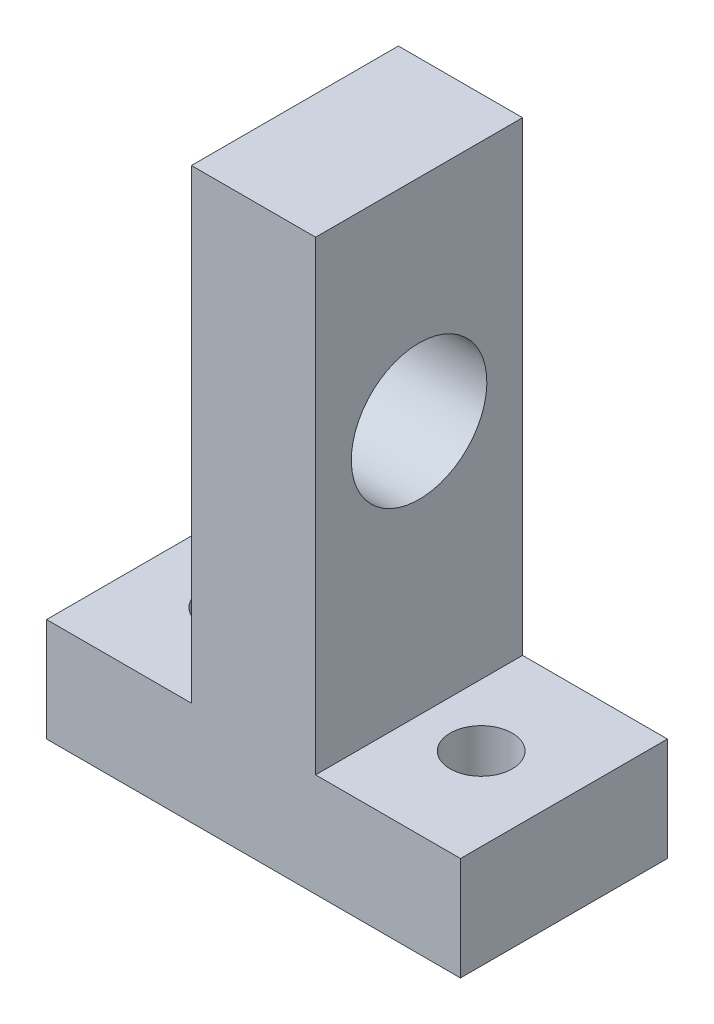
ISO-10303-21;
HEADER;
FILE_DESCRIPTION(('STEP AP214'),'2;1');
FILE_NAME('part.step','',(''),(''),'','','');
FILE_SCHEMA(('AUTOMOTIVE_DESIGN { 1 0 10303 214 1 1 1 1 }'));
ENDSEC;
DATA;
#1=APPLICATION_CONTEXT('core data for automotive mechanical design processes');
#2=APPLICATION_PROTOCOL_DEFINITION('international standard','automotive_design',2000,#1);
#3=PRODUCT_CONTEXT('',#1,'mechanical');
#4=PRODUCT('Part','Part','',(#3));
#5=PRODUCT_RELATED_PRODUCT_CATEGORY('part','',(#4));
#6=PRODUCT_DEFINITION_FORMATION('','',#4);
#7=PRODUCT_DEFINITION_CONTEXT('part definition',#1,'design');
#8=PRODUCT_DEFINITION('design','',#6,#7);
#9=PRODUCT_DEFINITION_SHAPE('','',#8);
#10=(LENGTH_UNIT() NAMED_UNIT(*) SI_UNIT(.MILLI.,.METRE.));
#11=(NAMED_UNIT(*) PLANE_ANGLE_UNIT() SI_UNIT($,.RADIAN.));
#12=(NAMED_UNIT(*) SI_UNIT($,.STERADIAN.) SOLID_ANGLE_UNIT());
#13=UNCERTAINTY_MEASURE_WITH_UNIT(LENGTH_MEASURE(1.E-05),#10,'distance_accuracy_value','');
#14=(GEOMETRIC_REPRESENTATION_CONTEXT(3) GLOBAL_UNCERTAINTY_ASSIGNED_CONTEXT((#13)) GLOBAL_UNIT_ASSIGNED_CONTEXT((#10,
#11,#12)) REPRESENTATION_CONTEXT('',''));
#15=CARTESIAN_POINT('',(0.,0.,0.));
#16=DIRECTION('',(0.,0.,1.));
#17=DIRECTION('',(1.,0.,0.));
#18=AXIS2_PLACEMENT_3D('',#15,#16,#17);
#19=CARTESIAN_POINT('',(3.,0.,5.));
#20=DIRECTION('',(1.,0.,0.));
#21=DIRECTION('',(0.,1.,0.));
#22=AXIS2_PLACEMENT_3D('',#19,#20,#21);
#23=PLANE('',#22);
#24=CARTESIAN_POINT('',(3.,3.55,0.));
#25=DIRECTION('',(1.,0.,0.));
#26=DIRECTION('',(0.,1.,0.));
#27=AXIS2_PLACEMENT_3D('',#24,#25,#26);
#28=CIRCLE('',#27,3.275);
#29=CARTESIAN_POINT('',(3.,6.825,0.));
#30=VERTEX_POINT('',#29);
#31=EDGE_CURVE('E185',#30,#30,#28,.T.);
#32=ORIENTED_EDGE('',*,*,#31,.F.);
#33=EDGE_LOOP('',(#32));
#34=FACE_BOUND('',#33,.T.);
#35=DIRECTION('',(0.,-1.,0.));
#36=VECTOR('',#35,1.);
#37=CARTESIAN_POINT('',(3.,0.,-5.));
#38=LINE('',#37,#36);
#39=CARTESIAN_POINT('',(3.,13.75,-5.));
#40=VERTEX_POINT('',#39);
#41=CARTESIAN_POINT('',(3.00000000000001,-8.75,-5.));
#42=VERTEX_POINT('',#41);
#43=EDGE_CURVE('E141',#40,#42,#38,.T.);
#44=ORIENTED_EDGE('',*,*,#43,.F.);
#45=DIRECTION('',(0.,0.,-1.));
#46=VECTOR('',#45,1.);
#47=CARTESIAN_POINT('',(3.,13.75,5.));
#48=LINE('',#47,#46);
#49=CARTESIAN_POINT('',(3.,13.75,5.));
#50=VERTEX_POINT('',#49);
#51=EDGE_CURVE('E11',#50,#40,#48,.T.);
#52=ORIENTED_EDGE('',*,*,#51,.F.);
#53=DIRECTION('',(0.,-1.,0.));
#54=VECTOR('',#53,1.);
#55=CARTESIAN_POINT('',(3.,0.,5.));
#56=LINE('',#55,#54);
#57=CARTESIAN_POINT('',(3.00000000000001,-8.75,5.));
#58=VERTEX_POINT('',#57);
#59=EDGE_CURVE('E166',#50,#58,#56,.T.);
#60=ORIENTED_EDGE('',*,*,#59,.T.);
#61=DIRECTION('',(0.,0.,-1.));
#62=VECTOR('',#61,1.);
#63=CARTESIAN_POINT('',(3.00000000000001,-8.75,5.));
#64=LINE('',#63,#62);
#65=EDGE_CURVE('E59',#58,#42,#64,.T.);
#66=ORIENTED_EDGE('',*,*,#65,.T.);
#67=EDGE_LOOP('',(#44,#52,#60,#66));
#68=FACE_BOUND('',#67,.T.);
#69=ADVANCED_FACE('F40',(#34,#68),#23,.T.);
#70=CARTESIAN_POINT('',(0.,13.75,5.));
#71=DIRECTION('',(0.,-1.,0.));
#72=DIRECTION('',(0.,0.,-1.));
#73=AXIS2_PLACEMENT_3D('',#70,#71,#72);
#74=PLANE('',#73);
#75=DIRECTION('',(-1.,0.,0.));
#76=VECTOR('',#75,1.);
#77=CARTESIAN_POINT('',(0.,13.75,-5.));
#78=LINE('',#77,#76);
#79=CARTESIAN_POINT('',(-3.,13.75,-5.));
#80=VERTEX_POINT('',#79);
#81=EDGE_CURVE('E144',#40,#80,#78,.T.);
#82=ORIENTED_EDGE('',*,*,#81,.T.);
#83=DIRECTION('',(0.,0.,-1.));
#84=VECTOR('',#83,1.);
#85=CARTESIAN_POINT('',(-3.,13.75,5.));
#86=LINE('',#85,#84);
#87=CARTESIAN_POINT('',(-3.,13.75,5.));
#88=VERTEX_POINT('',#87);
#89=EDGE_CURVE('E50',#88,#80,#86,.T.);
#90=ORIENTED_EDGE('',*,*,#89,.F.);
#91=DIRECTION('',(-1.,0.,0.));
#92=VECTOR('',#91,1.);
#93=CARTESIAN_POINT('',(0.,13.75,5.));
#94=LINE('',#93,#92);
#95=EDGE_CURVE('E201',#50,#88,#94,.T.);
#96=ORIENTED_EDGE('',*,*,#95,.F.);
#97=ORIENTED_EDGE('',*,*,#51,.T.);
#98=EDGE_LOOP('',(#82,#90,#96,#97));
#99=FACE_BOUND('',#98,.T.);
#100=ADVANCED_FACE('F238',(#99),#74,.F.);
#101=CARTESIAN_POINT('',(-3.,0.,5.));
#102=DIRECTION('',(1.,0.,0.));
#103=DIRECTION('',(0.,1.,0.));
#104=AXIS2_PLACEMENT_3D('',#101,#102,#103);
#105=PLANE('',#104);
#106=CARTESIAN_POINT('',(-3.,3.55,0.));
#107=DIRECTION('',(1.,0.,0.));
#108=DIRECTION('',(0.,1.,0.));
#109=AXIS2_PLACEMENT_3D('',#106,#107,#108);
#110=CIRCLE('',#109,3.275);
#111=CARTESIAN_POINT('',(-3.,6.825,0.));
#112=VERTEX_POINT('',#111);
#113=EDGE_CURVE('E145',#112,#112,#110,.T.);
#114=ORIENTED_EDGE('',*,*,#113,.T.);
#115=EDGE_LOOP('',(#114));
#116=FACE_BOUND('',#115,.T.);
#117=DIRECTION('',(0.,-1.,0.));
#118=VECTOR('',#117,1.);
#119=CARTESIAN_POINT('',(-3.,0.,-5.));
#120=LINE('',#119,#118);
#121=CARTESIAN_POINT('',(-3.,-8.75,-5.));
#122=VERTEX_POINT('',#121);
#123=EDGE_CURVE('E148',#80,#122,#120,.T.);
#124=ORIENTED_EDGE('',*,*,#123,.T.);
#125=DIRECTION('',(0.,0.,-1.));
#126=VECTOR('',#125,1.);
#127=CARTESIAN_POINT('',(-3.,-8.75,5.));
#128=LINE('',#127,#126);
#129=CARTESIAN_POINT('',(-3.,-8.75,5.));
#130=VERTEX_POINT('',#129);
#131=EDGE_CURVE('E177',#130,#122,#128,.T.);
#132=ORIENTED_EDGE('',*,*,#131,.F.);
#133=DIRECTION('',(0.,-1.,0.));
#134=VECTOR('',#133,1.);
#135=CARTESIAN_POINT('',(-3.,0.,5.));
#136=LINE('',#135,#134);
#137=EDGE_CURVE('E204',#88,#130,#136,.T.);
#138=ORIENTED_EDGE('',*,*,#137,.F.);
#139=ORIENTED_EDGE('',*,*,#89,.T.);
#140=EDGE_LOOP('',(#124,#132,#138,#139));
#141=FACE_BOUND('',#140,.T.);
#142=ADVANCED_FACE('F243',(#116,#141),#105,.F.);
#143=CARTESIAN_POINT('',(0.,-8.75,5.));
#144=DIRECTION('',(0.,-1.,0.));
#145=DIRECTION('',(0.,0.,-1.));
#146=AXIS2_PLACEMENT_3D('',#143,#144,#145);
#147=PLANE('',#146);
#148=CARTESIAN_POINT('',(-6.,-8.75,0.));
#149=DIRECTION('',(0.,-1.,0.));
#150=DIRECTION('',(0.,0.,-1.));
#151=AXIS2_PLACEMENT_3D('',#148,#149,#150);
#152=CIRCLE('',#151,1.5);
#153=CARTESIAN_POINT('',(-6.,-8.75,-1.5));
#154=VERTEX_POINT('',#153);
#155=EDGE_CURVE('E190',#154,#154,#152,.T.);
#156=ORIENTED_EDGE('',*,*,#155,.T.);
#157=EDGE_LOOP('',(#156));
#158=FACE_BOUND('',#157,.T.);
#159=DIRECTION('',(-1.,0.,0.));
#160=VECTOR('',#159,1.);
#161=CARTESIAN_POINT('',(0.,-8.75,-5.));
#162=LINE('',#161,#160);
#163=CARTESIAN_POINT('',(-9.99999999999999,-8.75,-5.));
#164=VERTEX_POINT('',#163);
#165=EDGE_CURVE('E151',#122,#164,#162,.T.);
#166=ORIENTED_EDGE('',*,*,#165,.T.);
#167=DIRECTION('',(0.,0.,-1.));
#168=VECTOR('',#167,1.);
#169=CARTESIAN_POINT('',(-9.99999999999999,-8.75,5.));
#170=LINE('',#169,#168);
#171=CARTESIAN_POINT('',(-9.99999999999999,-8.75,5.));
#172=VERTEX_POINT('',#171);
#173=EDGE_CURVE('E173',#172,#164,#170,.T.);
#174=ORIENTED_EDGE('',*,*,#173,.F.);
#175=DIRECTION('',(-1.,0.,0.));
#176=VECTOR('',#175,1.);
#177=CARTESIAN_POINT('',(0.,-8.75,5.));
#178=LINE('',#177,#176);
#179=EDGE_CURVE('E207',#130,#172,#178,.T.);
#180=ORIENTED_EDGE('',*,*,#179,.F.);
#181=ORIENTED_EDGE('',*,*,#131,.T.);
#182=EDGE_LOOP('',(#166,#174,#180,#181));
#183=FACE_BOUND('',#182,.T.);
#184=ADVANCED_FACE('F215',(#158,#183),#147,.F.);
#185=CARTESIAN_POINT('',(-9.99999999999999,0.,5.));
#186=DIRECTION('',(1.,0.,0.));
#187=DIRECTION('',(0.,0.,-1.));
#188=AXIS2_PLACEMENT_3D('',#185,#186,#187);
#189=PLANE('',#188);
#190=DIRECTION('',(0.,-1.,0.));
#191=VECTOR('',#190,1.);
#192=CARTESIAN_POINT('',(-9.99999999999999,0.,-5.));
#193=LINE('',#192,#191);
#194=CARTESIAN_POINT('',(-9.99999999999999,-13.75,-5.));
#195=VERTEX_POINT('',#194);
#196=EDGE_CURVE('E154',#164,#195,#193,.T.);
#197=ORIENTED_EDGE('',*,*,#196,.T.);
#198=DIRECTION('',(0.,0.,-1.));
#199=VECTOR('',#198,1.);
#200=CARTESIAN_POINT('',(-9.99999999999999,-13.75,5.));
#201=LINE('',#200,#199);
#202=CARTESIAN_POINT('',(-9.99999999999999,-13.75,5.));
#203=VERTEX_POINT('',#202);
#204=EDGE_CURVE('E131',#203,#195,#201,.T.);
#205=ORIENTED_EDGE('',*,*,#204,.F.);
#206=DIRECTION('',(0.,-1.,0.));
#207=VECTOR('',#206,1.);
#208=CARTESIAN_POINT('',(-9.99999999999999,0.,5.));
#209=LINE('',#208,#207);
#210=EDGE_CURVE('E117',#172,#203,#209,.T.);
#211=ORIENTED_EDGE('',*,*,#210,.F.);
#212=ORIENTED_EDGE('',*,*,#173,.T.);
#213=EDGE_LOOP('',(#197,#205,#211,#212));
#214=FACE_BOUND('',#213,.T.);
#215=ADVANCED_FACE('F219',(#214),#189,.F.);
#216=CARTESIAN_POINT('',(0.,-13.75,5.));
#217=DIRECTION('',(0.,1.,0.));
#218=DIRECTION('',(-1.,0.,0.));
#219=AXIS2_PLACEMENT_3D('',#216,#217,#218);
#220=PLANE('',#219);
#221=CARTESIAN_POINT('',(-6.,-13.75,0.));
#222=DIRECTION('',(0.,-1.,0.));
#223=DIRECTION('',(1.,0.,0.));
#224=AXIS2_PLACEMENT_3D('',#221,#222,#223);
#225=CIRCLE('',#224,1.5);
#226=CARTESIAN_POINT('',(-4.5,-13.75,0.));
#227=VERTEX_POINT('',#226);
#228=EDGE_CURVE('E261',#227,#227,#225,.T.);
#229=ORIENTED_EDGE('',*,*,#228,.F.);
#230=EDGE_LOOP('',(#229));
#231=FACE_BOUND('',#230,.T.);
#232=CARTESIAN_POINT('',(6.,-13.75,0.));
#233=DIRECTION('',(0.,-1.,0.));
#234=DIRECTION('',(-1.,0.,0.));
#235=AXIS2_PLACEMENT_3D('',#232,#233,#234);
#236=CIRCLE('',#235,1.5);
#237=CARTESIAN_POINT('',(4.5,-13.75,0.));
#238=VERTEX_POINT('',#237);
#239=EDGE_CURVE('E264',#238,#238,#236,.T.);
#240=ORIENTED_EDGE('',*,*,#239,.F.);
#241=EDGE_LOOP('',(#240));
#242=FACE_BOUND('',#241,.T.);
#243=DIRECTION('',(1.,0.,0.));
#244=VECTOR('',#243,1.);
#245=CARTESIAN_POINT('',(0.,-13.75,-5.));
#246=LINE('',#245,#244);
#247=CARTESIAN_POINT('',(10.,-13.75,-5.));
#248=VERTEX_POINT('',#247);
#249=EDGE_CURVE('E127',#195,#248,#246,.T.);
#250=ORIENTED_EDGE('',*,*,#249,.T.);
#251=DIRECTION('',(0.,0.,-1.));
#252=VECTOR('',#251,1.);
#253=CARTESIAN_POINT('',(10.,-13.75,5.));
#254=LINE('',#253,#252);
#255=CARTESIAN_POINT('',(10.,-13.75,5.));
#256=VERTEX_POINT('',#255);
#257=EDGE_CURVE('E124',#256,#248,#254,.T.);
#258=ORIENTED_EDGE('',*,*,#257,.F.);
#259=DIRECTION('',(1.,0.,0.));
#260=VECTOR('',#259,1.);
#261=CARTESIAN_POINT('',(0.,-13.75,5.));
#262=LINE('',#261,#260);
#263=EDGE_CURVE('E109',#203,#256,#262,.T.);
#264=ORIENTED_EDGE('',*,*,#263,.F.);
#265=ORIENTED_EDGE('',*,*,#204,.T.);
#266=EDGE_LOOP('',(#250,#258,#264,#265));
#267=FACE_BOUND('',#266,.T.);
#268=ADVANCED_FACE('F125',(#231,#242,#267),#220,.F.);
#269=CARTESIAN_POINT('',(10.,0.,5.));
#270=DIRECTION('',(1.,0.,0.));
#271=DIRECTION('',(0.,0.,-1.));
#272=AXIS2_PLACEMENT_3D('',#269,#270,#271);
#273=PLANE('',#272);
#274=DIRECTION('',(0.,-1.,0.));
#275=VECTOR('',#274,1.);
#276=CARTESIAN_POINT('',(10.,0.,-5.));
#277=LINE('',#276,#275);
#278=CARTESIAN_POINT('',(10.,-8.75,-5.));
#279=VERTEX_POINT('',#278);
#280=EDGE_CURVE('E159',#279,#248,#277,.T.);
#281=ORIENTED_EDGE('',*,*,#280,.F.);
#282=DIRECTION('',(0.,0.,-1.));
#283=VECTOR('',#282,1.);
#284=CARTESIAN_POINT('',(10.,-8.75,5.));
#285=LINE('',#284,#283);
#286=CARTESIAN_POINT('',(10.,-8.75,5.));
#287=VERTEX_POINT('',#286);
#288=EDGE_CURVE('E84',#287,#279,#285,.T.);
#289=ORIENTED_EDGE('',*,*,#288,.F.);
#290=DIRECTION('',(0.,-1.,0.));
#291=VECTOR('',#290,1.);
#292=CARTESIAN_POINT('',(10.,0.,5.));
#293=LINE('',#292,#291);
#294=EDGE_CURVE('E115',#287,#256,#293,.T.);
#295=ORIENTED_EDGE('',*,*,#294,.T.);
#296=ORIENTED_EDGE('',*,*,#257,.T.);
#297=EDGE_LOOP('',(#281,#289,#295,#296));
#298=FACE_BOUND('',#297,.T.);
#299=ADVANCED_FACE('F133',(#298),#273,.T.);
#300=CARTESIAN_POINT('',(0.,-8.75,5.));
#301=DIRECTION('',(0.,1.,0.));
#302=DIRECTION('',(-1.,0.,0.));
#303=AXIS2_PLACEMENT_3D('',#300,#301,#302);
#304=PLANE('',#303);
#305=CARTESIAN_POINT('',(6.,-8.75,0.));
#306=DIRECTION('',(0.,1.,0.));
#307=DIRECTION('',(-1.,0.,0.));
#308=AXIS2_PLACEMENT_3D('',#305,#306,#307);
#309=CIRCLE('',#308,1.5);
#310=CARTESIAN_POINT('',(4.5,-8.75,0.));
#311=VERTEX_POINT('',#310);
#312=EDGE_CURVE('E43',#311,#311,#309,.T.);
#313=ORIENTED_EDGE('',*,*,#312,.F.);
#314=EDGE_LOOP('',(#313));
#315=FACE_BOUND('',#314,.T.);
#316=DIRECTION('',(1.,0.,0.));
#317=VECTOR('',#316,1.);
#318=CARTESIAN_POINT('',(0.,-8.75,-5.));
#319=LINE('',#318,#317);
#320=EDGE_CURVE('E162',#42,#279,#319,.T.);
#321=ORIENTED_EDGE('',*,*,#320,.F.);
#322=ORIENTED_EDGE('',*,*,#65,.F.);
#323=DIRECTION('',(1.,0.,0.));
#324=VECTOR('',#323,1.);
#325=CARTESIAN_POINT('',(0.,-8.75,5.));
#326=LINE('',#325,#324);
#327=EDGE_CURVE('E135',#58,#287,#326,.T.);
#328=ORIENTED_EDGE('',*,*,#327,.T.);
#329=ORIENTED_EDGE('',*,*,#288,.T.);
#330=EDGE_LOOP('',(#321,#322,#328,#329));
#331=FACE_BOUND('',#330,.T.);
#332=ADVANCED_FACE('F223',(#315,#331),#304,.T.);
#333=CARTESIAN_POINT('',(0.,0.,5.));
#334=DIRECTION('',(0.,0.,1.));
#335=DIRECTION('',(1.,0.,0.));
#336=AXIS2_PLACEMENT_3D('',#333,#334,#335);
#337=PLANE('',#336);
#338=ORIENTED_EDGE('',*,*,#59,.F.);
#339=ORIENTED_EDGE('',*,*,#95,.T.);
#340=ORIENTED_EDGE('',*,*,#137,.T.);
#341=ORIENTED_EDGE('',*,*,#179,.T.);
#342=ORIENTED_EDGE('',*,*,#210,.T.);
#343=ORIENTED_EDGE('',*,*,#263,.T.);
#344=ORIENTED_EDGE('',*,*,#294,.F.);
#345=ORIENTED_EDGE('',*,*,#327,.F.);
#346=EDGE_LOOP('',(#338,#339,#340,#341,#342,#343,#344,#345));
#347=FACE_BOUND('',#346,.T.);
#348=ADVANCED_FACE('F112',(#347),#337,.T.);
#349=CARTESIAN_POINT('',(0.,0.,-5.));
#350=DIRECTION('',(0.,0.,1.));
#351=DIRECTION('',(1.,0.,0.));
#352=AXIS2_PLACEMENT_3D('',#349,#350,#351);
#353=PLANE('',#352);
#354=ORIENTED_EDGE('',*,*,#43,.T.);
#355=ORIENTED_EDGE('',*,*,#320,.T.);
#356=ORIENTED_EDGE('',*,*,#280,.T.);
#357=ORIENTED_EDGE('',*,*,#249,.F.);
#358=ORIENTED_EDGE('',*,*,#196,.F.);
#359=ORIENTED_EDGE('',*,*,#165,.F.);
#360=ORIENTED_EDGE('',*,*,#123,.F.);
#361=ORIENTED_EDGE('',*,*,#81,.F.);
#362=EDGE_LOOP('',(#354,#355,#356,#357,#358,#359,#360,#361));
#363=FACE_BOUND('',#362,.T.);
#364=ADVANCED_FACE('F221',(#363),#353,.F.);
#365=CARTESIAN_POINT('',(-12.,3.55,0.));
#366=DIRECTION('',(1.,0.,0.));
#367=DIRECTION('',(0.,1.,0.));
#368=AXIS2_PLACEMENT_3D('',#365,#366,#367);
#369=CYLINDRICAL_SURFACE('',#368,3.275);
#370=ORIENTED_EDGE('',*,*,#31,.T.);
#371=EDGE_LOOP('',(#370));
#372=FACE_BOUND('',#371,.T.);
#373=ORIENTED_EDGE('',*,*,#113,.F.);
#374=EDGE_LOOP('',(#373));
#375=FACE_BOUND('',#374,.T.);
#376=ADVANCED_FACE('F276',(#372,#375),#369,.F.);
#377=CARTESIAN_POINT('',(6.,-3.75,0.));
#378=DIRECTION('',(0.,-1.,0.));
#379=DIRECTION('',(1.,0.,0.));
#380=AXIS2_PLACEMENT_3D('',#377,#378,#379);
#381=CYLINDRICAL_SURFACE('',#380,1.5);
#382=ORIENTED_EDGE('',*,*,#312,.T.);
#383=EDGE_LOOP('',(#382));
#384=FACE_BOUND('',#383,.T.);
#385=ORIENTED_EDGE('',*,*,#239,.T.);
#386=EDGE_LOOP('',(#385));
#387=FACE_BOUND('',#386,.T.);
#388=ADVANCED_FACE('F273',(#384,#387),#381,.F.);
#389=CARTESIAN_POINT('',(-6.,-3.75,0.));
#390=DIRECTION('',(0.,-1.,0.));
#391=DIRECTION('',(1.,0.,0.));
#392=AXIS2_PLACEMENT_3D('',#389,#390,#391);
#393=CYLINDRICAL_SURFACE('',#392,1.5);
#394=ORIENTED_EDGE('',*,*,#228,.T.);
#395=EDGE_LOOP('',(#394));
#396=FACE_BOUND('',#395,.T.);
#397=ORIENTED_EDGE('',*,*,#155,.F.);
#398=EDGE_LOOP('',(#397));
#399=FACE_BOUND('',#398,.T.);
#400=ADVANCED_FACE('F275',(#396,#399),#393,.F.);
#401=CLOSED_SHELL('',(#69,#100,#142,#184,#215,#268,#299,#332,#348,#364,#376,#388,#400));
#402=MANIFOLD_SOLID_BREP('B2',#401);
#403=ADVANCED_BREP_SHAPE_REPRESENTATION('',(#18,#402),#14);
#404=SHAPE_DEFINITION_REPRESENTATION(#9,#403);
ENDSEC;
END-ISO-10303-21;
